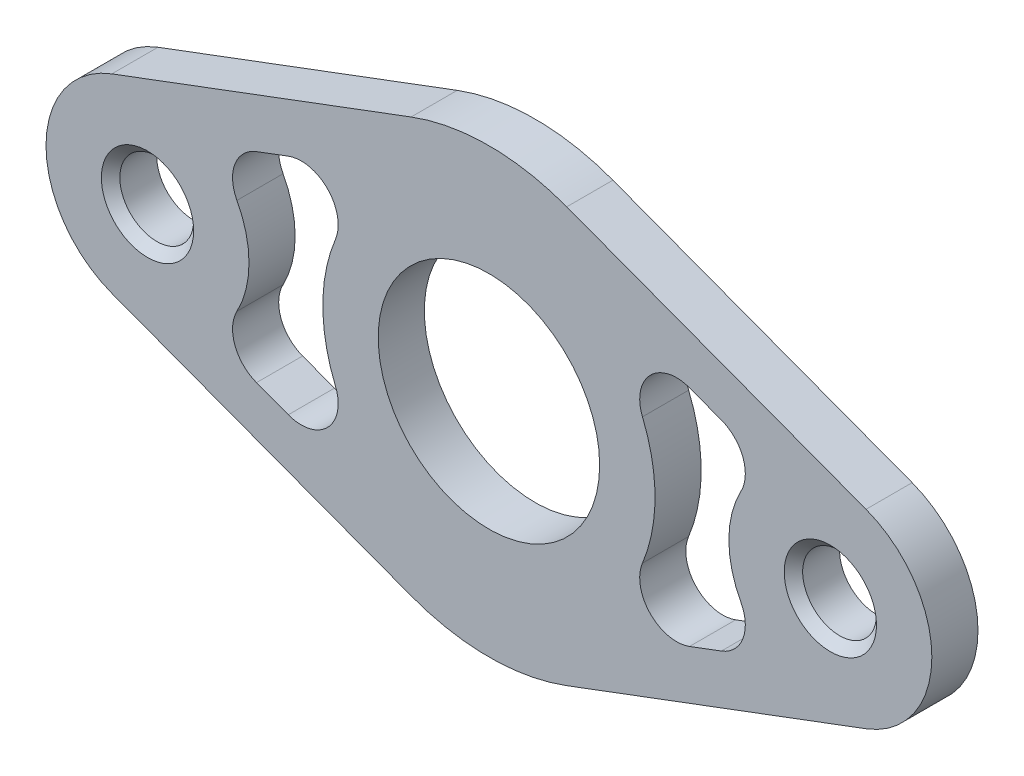
ISO-10303-21;
HEADER;
FILE_DESCRIPTION(('STEP AP214'),'2;1');
FILE_NAME('part.step','',(''),(''),'','','');
FILE_SCHEMA(('AUTOMOTIVE_DESIGN { 1 0 10303 214 1 1 1 1 }'));
ENDSEC;
DATA;
#1=APPLICATION_CONTEXT('core data for automotive mechanical design processes');
#2=APPLICATION_PROTOCOL_DEFINITION('international standard','automotive_design',2000,#1);
#3=PRODUCT_CONTEXT('',#1,'mechanical');
#4=PRODUCT('Part','Part','',(#3));
#5=PRODUCT_RELATED_PRODUCT_CATEGORY('part','',(#4));
#6=PRODUCT_DEFINITION_FORMATION('','',#4);
#7=PRODUCT_DEFINITION_CONTEXT('part definition',#1,'design');
#8=PRODUCT_DEFINITION('design','',#6,#7);
#9=PRODUCT_DEFINITION_SHAPE('','',#8);
#10=(LENGTH_UNIT() NAMED_UNIT(*) SI_UNIT(.MILLI.,.METRE.));
#11=(NAMED_UNIT(*) PLANE_ANGLE_UNIT() SI_UNIT($,.RADIAN.));
#12=(NAMED_UNIT(*) SI_UNIT($,.STERADIAN.) SOLID_ANGLE_UNIT());
#13=UNCERTAINTY_MEASURE_WITH_UNIT(LENGTH_MEASURE(1.E-05),#10,'distance_accuracy_value','');
#14=(GEOMETRIC_REPRESENTATION_CONTEXT(3) GLOBAL_UNCERTAINTY_ASSIGNED_CONTEXT((#13)) GLOBAL_UNIT_ASSIGNED_CONTEXT((#10,
#11,#12)) REPRESENTATION_CONTEXT('',''));
#15=CARTESIAN_POINT('',(0.,0.,0.));
#16=DIRECTION('',(0.,0.,1.));
#17=DIRECTION('',(1.,0.,0.));
#18=AXIS2_PLACEMENT_3D('',#15,#16,#17);
#19=CARTESIAN_POINT('',(0.,0.,5.));
#20=DIRECTION('',(0.,0.,1.));
#21=DIRECTION('',(1.,0.,0.));
#22=AXIS2_PLACEMENT_3D('',#19,#20,#21);
#23=PLANE('',#22);
#24=CARTESIAN_POINT('',(37.,0.,5.));
#25=DIRECTION('',(0.,0.,1.));
#26=DIRECTION('',(1.,0.,0.));
#27=AXIS2_PLACEMENT_3D('',#24,#25,#26);
#28=CIRCLE('',#27,4.99999999999999);
#29=CARTESIAN_POINT('',(42.,0.,5.));
#30=VERTEX_POINT('',#29);
#31=EDGE_CURVE('E481',#30,#30,#28,.F.);
#32=ORIENTED_EDGE('',*,*,#31,.T.);
#33=EDGE_LOOP('',(#32));
#34=FACE_BOUND('',#33,.T.);
#35=CARTESIAN_POINT('',(-37.,0.,5.));
#36=DIRECTION('',(0.,0.,1.));
#37=DIRECTION('',(1.,0.,0.));
#38=AXIS2_PLACEMENT_3D('',#35,#36,#37);
#39=CIRCLE('',#38,5.00000000000002);
#40=CARTESIAN_POINT('',(-32.,0.,5.));
#41=VERTEX_POINT('',#40);
#42=EDGE_CURVE('E477',#41,#41,#39,.F.);
#43=ORIENTED_EDGE('',*,*,#42,.T.);
#44=EDGE_LOOP('',(#43));
#45=FACE_BOUND('',#44,.T.);
#46=CARTESIAN_POINT('',(-20.337686340288,-8.38919032589347,5.));
#47=DIRECTION('',(0.,0.,1.));
#48=DIRECTION('',(1.,0.,0.));
#49=AXIS2_PLACEMENT_3D('',#46,#47,#48);
#50=CIRCLE('',#49,4.);
#51=CARTESIAN_POINT('',(-21.7430917456934,-12.1341650449613,5.));
#52=VERTEX_POINT('',#51);
#53=CARTESIAN_POINT('',(-16.6399251875083,-6.86388299391284,5.));
#54=VERTEX_POINT('',#53);
#55=EDGE_CURVE('E74',#52,#54,#50,.T.);
#56=ORIENTED_EDGE('',*,*,#55,.F.);
#57=DIRECTION('',(0.93624367976696,-0.351351351351352,0.));
#58=VECTOR('',#57,1.);
#59=CARTESIAN_POINT('',(-21.7430917456934,-12.1341650449613,5.));
#60=LINE('',#59,#58);
#61=CARTESIAN_POINT('',(-25.18984520045,-10.8406754222542,5.));
#62=VERTEX_POINT('',#61);
#63=EDGE_CURVE('E344',#62,#52,#60,.T.);
#64=ORIENTED_EDGE('',*,*,#63,.F.);
#65=CARTESIAN_POINT('',(-23.7844397950446,-7.09570070318635,5.));
#66=DIRECTION('',(0.,0.,1.));
#67=DIRECTION('',(-1.,0.,0.));
#68=AXIS2_PLACEMENT_3D('',#65,#66,#67);
#69=CIRCLE('',#68,4.);
#70=CARTESIAN_POINT('',(-27.3085891830327,-5.20351384900332,5.));
#71=VERTEX_POINT('',#70);
#72=EDGE_CURVE('E340',#71,#62,#69,.T.);
#73=ORIENTED_EDGE('',*,*,#72,.F.);
#74=CARTESIAN_POINT('',(-37.,0.,5.));
#75=DIRECTION('',(0.,0.,-1.));
#76=DIRECTION('',(-1.,0.,0.));
#77=AXIS2_PLACEMENT_3D('',#74,#75,#76);
#78=CIRCLE('',#77,11.);
#79=CARTESIAN_POINT('',(-27.3085891830327,5.20351384900334,5.));
#80=VERTEX_POINT('',#79);
#81=EDGE_CURVE('E336',#80,#71,#78,.T.);
#82=ORIENTED_EDGE('',*,*,#81,.F.);
#83=CARTESIAN_POINT('',(-23.7844397950446,7.09570070318637,5.));
#84=DIRECTION('',(0.,0.,1.));
#85=DIRECTION('',(1.,0.,0.));
#86=AXIS2_PLACEMENT_3D('',#83,#84,#85);
#87=CIRCLE('',#86,4.);
#88=CARTESIAN_POINT('',(-25.18984520045,10.8406754222542,5.));
#89=VERTEX_POINT('',#88);
#90=EDGE_CURVE('E332',#89,#80,#87,.T.);
#91=ORIENTED_EDGE('',*,*,#90,.F.);
#92=DIRECTION('',(-0.936243679766961,-0.351351351351351,0.));
#93=VECTOR('',#92,1.);
#94=CARTESIAN_POINT('',(-21.7430917456934,12.1341650449613,5.));
#95=LINE('',#94,#93);
#96=CARTESIAN_POINT('',(-21.7430917456934,12.1341650449613,5.));
#97=VERTEX_POINT('',#96);
#98=EDGE_CURVE('E328',#97,#89,#95,.T.);
#99=ORIENTED_EDGE('',*,*,#98,.F.);
#100=CARTESIAN_POINT('',(-20.337686340288,8.38919032589349,5.));
#101=DIRECTION('',(0.,0.,1.));
#102=DIRECTION('',(-1.,0.,0.));
#103=AXIS2_PLACEMENT_3D('',#100,#101,#102);
#104=CIRCLE('',#103,4.);
#105=CARTESIAN_POINT('',(-16.6399251875083,6.86388299391286,5.));
#106=VERTEX_POINT('',#105);
#107=EDGE_CURVE('E324',#106,#97,#104,.T.);
#108=ORIENTED_EDGE('',*,*,#107,.F.);
#109=CARTESIAN_POINT('',(0.,0.,5.));
#110=DIRECTION('',(0.,0.,-1.));
#111=DIRECTION('',(-1.,0.,0.));
#112=AXIS2_PLACEMENT_3D('',#109,#110,#111);
#113=CIRCLE('',#112,18.);
#114=EDGE_CURVE('E320',#54,#106,#113,.T.);
#115=ORIENTED_EDGE('',*,*,#114,.F.);
#116=EDGE_LOOP('',(#56,#64,#73,#82,#91,#99,#108,#115));
#117=FACE_BOUND('',#116,.T.);
#118=CARTESIAN_POINT('',(0.,0.,5.));
#119=DIRECTION('',(0.,0.,1.));
#120=DIRECTION('',(1.,0.,0.));
#121=AXIS2_PLACEMENT_3D('',#118,#119,#120);
#122=CIRCLE('',#121,12.);
#123=CARTESIAN_POINT('',(12.,0.,5.));
#124=VERTEX_POINT('',#123);
#125=EDGE_CURVE('E377',#124,#124,#122,.T.);
#126=ORIENTED_EDGE('',*,*,#125,.F.);
#127=EDGE_LOOP('',(#126));
#128=FACE_BOUND('',#127,.T.);
#129=DIRECTION('',(-0.936243679766961,0.351351351351351,0.));
#130=VECTOR('',#129,1.);
#131=CARTESIAN_POINT('',(8.43243243243243,22.4698483144071,5.));
#132=LINE('',#131,#130);
#133=CARTESIAN_POINT('',(40.8648648648649,10.2986804774366,5.));
#134=VERTEX_POINT('',#133);
#135=CARTESIAN_POINT('',(8.43243243243244,22.4698483144071,5.));
#136=VERTEX_POINT('',#135);
#137=EDGE_CURVE('E381',#134,#136,#132,.T.);
#138=ORIENTED_EDGE('',*,*,#137,.T.);
#139=CARTESIAN_POINT('',(0.,0.,5.));
#140=DIRECTION('',(0.,0.,1.));
#141=DIRECTION('',(1.,0.,0.));
#142=AXIS2_PLACEMENT_3D('',#139,#140,#141);
#143=CIRCLE('',#142,24.);
#144=CARTESIAN_POINT('',(-8.43243243243244,22.4698483144071,5.));
#145=VERTEX_POINT('',#144);
#146=EDGE_CURVE('E386',#136,#145,#143,.T.);
#147=ORIENTED_EDGE('',*,*,#146,.T.);
#148=DIRECTION('',(0.936243679766961,0.351351351351352,0.));
#149=VECTOR('',#148,1.);
#150=CARTESIAN_POINT('',(-8.43243243243244,22.4698483144071,5.));
#151=LINE('',#150,#149);
#152=CARTESIAN_POINT('',(-40.8648648648649,10.2986804774366,5.));
#153=VERTEX_POINT('',#152);
#154=EDGE_CURVE('E389',#153,#145,#151,.T.);
#155=ORIENTED_EDGE('',*,*,#154,.F.);
#156=CARTESIAN_POINT('',(-37.,0.,5.));
#157=DIRECTION('',(0.,0.,1.));
#158=DIRECTION('',(1.,0.,0.));
#159=AXIS2_PLACEMENT_3D('',#156,#157,#158);
#160=CIRCLE('',#159,11.);
#161=CARTESIAN_POINT('',(-40.8648648648649,-10.2986804774366,5.));
#162=VERTEX_POINT('',#161);
#163=EDGE_CURVE('E393',#153,#162,#160,.T.);
#164=ORIENTED_EDGE('',*,*,#163,.T.);
#165=DIRECTION('',(0.936243679766961,-0.351351351351352,0.));
#166=VECTOR('',#165,1.);
#167=CARTESIAN_POINT('',(-8.43243243243244,-22.4698483144071,5.));
#168=LINE('',#167,#166);
#169=CARTESIAN_POINT('',(-8.43243243243244,-22.4698483144071,5.));
#170=VERTEX_POINT('',#169);
#171=EDGE_CURVE('E396',#162,#170,#168,.T.);
#172=ORIENTED_EDGE('',*,*,#171,.T.);
#173=CARTESIAN_POINT('',(0.,0.,5.));
#174=DIRECTION('',(0.,0.,1.));
#175=DIRECTION('',(1.,0.,0.));
#176=AXIS2_PLACEMENT_3D('',#173,#174,#175);
#177=CIRCLE('',#176,24.);
#178=CARTESIAN_POINT('',(8.43243243243244,-22.469848314407,5.));
#179=VERTEX_POINT('',#178);
#180=EDGE_CURVE('E399',#170,#179,#177,.T.);
#181=ORIENTED_EDGE('',*,*,#180,.T.);
#182=DIRECTION('',(-0.936243679766961,-0.351351351351351,0.));
#183=VECTOR('',#182,1.);
#184=CARTESIAN_POINT('',(8.43243243243242,-22.469848314407,5.));
#185=LINE('',#184,#183);
#186=CARTESIAN_POINT('',(40.8648648648649,-10.2986804774366,5.));
#187=VERTEX_POINT('',#186);
#188=EDGE_CURVE('E402',#187,#179,#185,.T.);
#189=ORIENTED_EDGE('',*,*,#188,.F.);
#190=CARTESIAN_POINT('',(37.,0.,5.));
#191=DIRECTION('',(0.,0.,1.));
#192=DIRECTION('',(1.,0.,0.));
#193=AXIS2_PLACEMENT_3D('',#190,#191,#192);
#194=CIRCLE('',#193,11.);
#195=EDGE_CURVE('E406',#134,#187,#194,.F.);
#196=ORIENTED_EDGE('',*,*,#195,.F.);
#197=EDGE_LOOP('',(#138,#147,#155,#164,#172,#181,#189,#196));
#198=FACE_BOUND('',#197,.T.);
#199=CARTESIAN_POINT('',(20.337686340288,8.38919032589349,5.));
#200=DIRECTION('',(0.,0.,1.));
#201=DIRECTION('',(1.,0.,0.));
#202=AXIS2_PLACEMENT_3D('',#199,#200,#201);
#203=CIRCLE('',#202,4.);
#204=CARTESIAN_POINT('',(21.7430917456934,12.1341650449613,5.));
#205=VERTEX_POINT('',#204);
#206=CARTESIAN_POINT('',(16.6399251875083,6.86388299391286,5.));
#207=VERTEX_POINT('',#206);
#208=EDGE_CURVE('E66',#205,#207,#203,.T.);
#209=ORIENTED_EDGE('',*,*,#208,.F.);
#210=DIRECTION('',(-0.936243679766961,0.351351351351351,0.));
#211=VECTOR('',#210,1.);
#212=CARTESIAN_POINT('',(21.7430917456934,12.1341650449613,5.));
#213=LINE('',#212,#211);
#214=CARTESIAN_POINT('',(25.18984520045,10.8406754222542,5.));
#215=VERTEX_POINT('',#214);
#216=EDGE_CURVE('E221',#215,#205,#213,.T.);
#217=ORIENTED_EDGE('',*,*,#216,.F.);
#218=CARTESIAN_POINT('',(23.7844397950446,7.09570070318637,5.));
#219=DIRECTION('',(0.,0.,1.));
#220=DIRECTION('',(-1.,0.,0.));
#221=AXIS2_PLACEMENT_3D('',#218,#219,#220);
#222=CIRCLE('',#221,4.);
#223=CARTESIAN_POINT('',(27.3085891830327,5.20351384900334,5.));
#224=VERTEX_POINT('',#223);
#225=EDGE_CURVE('E265',#224,#215,#222,.T.);
#226=ORIENTED_EDGE('',*,*,#225,.F.);
#227=CARTESIAN_POINT('',(37.,0.,5.));
#228=DIRECTION('',(0.,0.,-1.));
#229=DIRECTION('',(1.,0.,0.));
#230=AXIS2_PLACEMENT_3D('',#227,#228,#229);
#231=CIRCLE('',#230,11.);
#232=CARTESIAN_POINT('',(27.3085891830327,-5.20351384900332,5.));
#233=VERTEX_POINT('',#232);
#234=EDGE_CURVE('E261',#233,#224,#231,.T.);
#235=ORIENTED_EDGE('',*,*,#234,.F.);
#236=CARTESIAN_POINT('',(23.7844397950446,-7.09570070318635,5.));
#237=DIRECTION('',(0.,0.,1.));
#238=DIRECTION('',(1.,0.,0.));
#239=AXIS2_PLACEMENT_3D('',#236,#237,#238);
#240=CIRCLE('',#239,4.);
#241=CARTESIAN_POINT('',(25.18984520045,-10.8406754222542,5.));
#242=VERTEX_POINT('',#241);
#243=EDGE_CURVE('E257',#242,#233,#240,.T.);
#244=ORIENTED_EDGE('',*,*,#243,.F.);
#245=DIRECTION('',(0.93624367976696,0.351351351351352,0.));
#246=VECTOR('',#245,1.);
#247=CARTESIAN_POINT('',(21.7430917456934,-12.1341650449613,5.));
#248=LINE('',#247,#246);
#249=CARTESIAN_POINT('',(21.7430917456934,-12.1341650449613,5.));
#250=VERTEX_POINT('',#249);
#251=EDGE_CURVE('E253',#250,#242,#248,.T.);
#252=ORIENTED_EDGE('',*,*,#251,.F.);
#253=CARTESIAN_POINT('',(20.337686340288,-8.38919032589347,5.));
#254=DIRECTION('',(0.,0.,1.));
#255=DIRECTION('',(-1.,0.,0.));
#256=AXIS2_PLACEMENT_3D('',#253,#254,#255);
#257=CIRCLE('',#256,4.);
#258=CARTESIAN_POINT('',(16.6399251875083,-6.86388299391284,5.));
#259=VERTEX_POINT('',#258);
#260=EDGE_CURVE('E249',#259,#250,#257,.T.);
#261=ORIENTED_EDGE('',*,*,#260,.F.);
#262=CARTESIAN_POINT('',(0.,0.,5.));
#263=DIRECTION('',(0.,0.,-1.));
#264=DIRECTION('',(1.,0.,0.));
#265=AXIS2_PLACEMENT_3D('',#262,#263,#264);
#266=CIRCLE('',#265,18.);
#267=EDGE_CURVE('E241',#207,#259,#266,.T.);
#268=ORIENTED_EDGE('',*,*,#267,.F.);
#269=EDGE_LOOP('',(#209,#217,#226,#235,#244,#252,#261,#268));
#270=FACE_BOUND('',#269,.T.);
#271=ADVANCED_FACE('F49',(#34,#45,#117,#128,#198,#270),#23,.T.);
#272=CARTESIAN_POINT('',(0.,0.,0.));
#273=DIRECTION('',(0.,0.,1.));
#274=DIRECTION('',(1.,0.,0.));
#275=AXIS2_PLACEMENT_3D('',#272,#273,#274);
#276=PLANE('',#275);
#277=CARTESIAN_POINT('',(0.,0.,0.));
#278=DIRECTION('',(0.,0.,1.));
#279=DIRECTION('',(1.,0.,0.));
#280=AXIS2_PLACEMENT_3D('',#277,#278,#279);
#281=CIRCLE('',#280,12.);
#282=CARTESIAN_POINT('',(12.,0.,0.));
#283=VERTEX_POINT('',#282);
#284=EDGE_CURVE('E230',#283,#283,#281,.T.);
#285=ORIENTED_EDGE('',*,*,#284,.T.);
#286=EDGE_LOOP('',(#285));
#287=FACE_BOUND('',#286,.T.);
#288=CARTESIAN_POINT('',(37.,0.,0.));
#289=DIRECTION('',(0.,0.,1.));
#290=DIRECTION('',(1.,0.,0.));
#291=AXIS2_PLACEMENT_3D('',#288,#289,#290);
#292=CIRCLE('',#291,4.00000000000001);
#293=CARTESIAN_POINT('',(41.,0.,0.));
#294=VERTEX_POINT('',#293);
#295=EDGE_CURVE('E414',#294,#294,#292,.F.);
#296=ORIENTED_EDGE('',*,*,#295,.F.);
#297=EDGE_LOOP('',(#296));
#298=FACE_BOUND('',#297,.T.);
#299=CARTESIAN_POINT('',(-37.,0.,0.));
#300=DIRECTION('',(0.,0.,1.));
#301=DIRECTION('',(1.,0.,0.));
#302=AXIS2_PLACEMENT_3D('',#299,#300,#301);
#303=CIRCLE('',#302,4.00000000000001);
#304=CARTESIAN_POINT('',(-33.,0.,0.));
#305=VERTEX_POINT('',#304);
#306=EDGE_CURVE('E418',#305,#305,#303,.T.);
#307=ORIENTED_EDGE('',*,*,#306,.T.);
#308=EDGE_LOOP('',(#307));
#309=FACE_BOUND('',#308,.T.);
#310=DIRECTION('',(-0.936243679766961,0.351351351351351,0.));
#311=VECTOR('',#310,1.);
#312=CARTESIAN_POINT('',(8.43243243243243,22.4698483144071,0.));
#313=LINE('',#312,#311);
#314=CARTESIAN_POINT('',(40.8648648648649,10.2986804774366,0.));
#315=VERTEX_POINT('',#314);
#316=CARTESIAN_POINT('',(8.43243243243244,22.4698483144071,0.));
#317=VERTEX_POINT('',#316);
#318=EDGE_CURVE('E422',#315,#317,#313,.T.);
#319=ORIENTED_EDGE('',*,*,#318,.F.);
#320=CARTESIAN_POINT('',(37.,0.,0.));
#321=DIRECTION('',(0.,0.,1.));
#322=DIRECTION('',(1.,0.,0.));
#323=AXIS2_PLACEMENT_3D('',#320,#321,#322);
#324=CIRCLE('',#323,11.);
#325=CARTESIAN_POINT('',(40.8648648648649,-10.2986804774366,0.));
#326=VERTEX_POINT('',#325);
#327=EDGE_CURVE('E382',#315,#326,#324,.F.);
#328=ORIENTED_EDGE('',*,*,#327,.T.);
#329=DIRECTION('',(-0.936243679766961,-0.351351351351351,0.));
#330=VECTOR('',#329,1.);
#331=CARTESIAN_POINT('',(8.43243243243242,-22.469848314407,0.));
#332=LINE('',#331,#330);
#333=CARTESIAN_POINT('',(8.43243243243244,-22.469848314407,0.));
#334=VERTEX_POINT('',#333);
#335=EDGE_CURVE('E444',#326,#334,#332,.T.);
#336=ORIENTED_EDGE('',*,*,#335,.T.);
#337=CARTESIAN_POINT('',(0.,0.,0.));
#338=DIRECTION('',(0.,0.,1.));
#339=DIRECTION('',(1.,0.,0.));
#340=AXIS2_PLACEMENT_3D('',#337,#338,#339);
#341=CIRCLE('',#340,24.);
#342=CARTESIAN_POINT('',(-8.43243243243244,-22.4698483144071,0.));
#343=VERTEX_POINT('',#342);
#344=EDGE_CURVE('E440',#343,#334,#341,.T.);
#345=ORIENTED_EDGE('',*,*,#344,.F.);
#346=DIRECTION('',(0.936243679766961,-0.351351351351352,0.));
#347=VECTOR('',#346,1.);
#348=CARTESIAN_POINT('',(-8.43243243243244,-22.4698483144071,0.));
#349=LINE('',#348,#347);
#350=CARTESIAN_POINT('',(-40.8648648648649,-10.2986804774366,0.));
#351=VERTEX_POINT('',#350);
#352=EDGE_CURVE('E437',#351,#343,#349,.T.);
#353=ORIENTED_EDGE('',*,*,#352,.F.);
#354=CARTESIAN_POINT('',(-37.,0.,0.));
#355=DIRECTION('',(0.,0.,1.));
#356=DIRECTION('',(1.,0.,0.));
#357=AXIS2_PLACEMENT_3D('',#354,#355,#356);
#358=CIRCLE('',#357,11.);
#359=CARTESIAN_POINT('',(-40.8648648648649,10.2986804774366,0.));
#360=VERTEX_POINT('',#359);
#361=EDGE_CURVE('E434',#360,#351,#358,.T.);
#362=ORIENTED_EDGE('',*,*,#361,.F.);
#363=DIRECTION('',(0.936243679766961,0.351351351351352,0.));
#364=VECTOR('',#363,1.);
#365=CARTESIAN_POINT('',(-8.43243243243244,22.4698483144071,0.));
#366=LINE('',#365,#364);
#367=CARTESIAN_POINT('',(-8.43243243243244,22.4698483144071,0.));
#368=VERTEX_POINT('',#367);
#369=EDGE_CURVE('E430',#360,#368,#366,.T.);
#370=ORIENTED_EDGE('',*,*,#369,.T.);
#371=CARTESIAN_POINT('',(0.,0.,0.));
#372=DIRECTION('',(0.,0.,1.));
#373=DIRECTION('',(1.,0.,0.));
#374=AXIS2_PLACEMENT_3D('',#371,#372,#373);
#375=CIRCLE('',#374,24.);
#376=EDGE_CURVE('E426',#317,#368,#375,.T.);
#377=ORIENTED_EDGE('',*,*,#376,.F.);
#378=EDGE_LOOP('',(#319,#328,#336,#345,#353,#362,#370,#377));
#379=FACE_BOUND('',#378,.T.);
#380=DIRECTION('',(-0.936243679766961,0.351351351351352,0.));
#381=VECTOR('',#380,1.);
#382=CARTESIAN_POINT('',(-21.7430917456934,-12.1341650449613,0.));
#383=LINE('',#382,#381);
#384=CARTESIAN_POINT('',(-21.7430917456934,-12.1341650449613,0.));
#385=VERTEX_POINT('',#384);
#386=CARTESIAN_POINT('',(-25.18984520045,-10.8406754222542,0.));
#387=VERTEX_POINT('',#386);
#388=EDGE_CURVE('E310',#385,#387,#383,.T.);
#389=ORIENTED_EDGE('',*,*,#388,.F.);
#390=CARTESIAN_POINT('',(-20.337686340288,-8.38919032589347,0.));
#391=DIRECTION('',(0.,0.,1.));
#392=DIRECTION('',(1.,0.,0.));
#393=AXIS2_PLACEMENT_3D('',#390,#391,#392);
#394=CIRCLE('',#393,4.);
#395=CARTESIAN_POINT('',(-16.6399251875083,-6.86388299391284,0.));
#396=VERTEX_POINT('',#395);
#397=EDGE_CURVE('E314',#396,#385,#394,.F.);
#398=ORIENTED_EDGE('',*,*,#397,.F.);
#399=CARTESIAN_POINT('',(0.,0.,0.));
#400=DIRECTION('',(0.,0.,1.));
#401=DIRECTION('',(1.,0.,0.));
#402=AXIS2_PLACEMENT_3D('',#399,#400,#401);
#403=CIRCLE('',#402,18.);
#404=CARTESIAN_POINT('',(-16.6399251875083,6.86388299391286,0.));
#405=VERTEX_POINT('',#404);
#406=EDGE_CURVE('E352',#405,#396,#403,.T.);
#407=ORIENTED_EDGE('',*,*,#406,.F.);
#408=CARTESIAN_POINT('',(-20.337686340288,8.38919032589349,0.));
#409=DIRECTION('',(0.,0.,1.));
#410=DIRECTION('',(1.,0.,0.));
#411=AXIS2_PLACEMENT_3D('',#408,#409,#410);
#412=CIRCLE('',#411,4.);
#413=CARTESIAN_POINT('',(-21.7430917456934,12.1341650449613,0.));
#414=VERTEX_POINT('',#413);
#415=EDGE_CURVE('E291',#414,#405,#412,.F.);
#416=ORIENTED_EDGE('',*,*,#415,.F.);
#417=DIRECTION('',(0.936243679766961,0.351351351351351,0.));
#418=VECTOR('',#417,1.);
#419=CARTESIAN_POINT('',(-21.7430917456934,12.1341650449613,0.));
#420=LINE('',#419,#418);
#421=CARTESIAN_POINT('',(-25.18984520045,10.8406754222542,0.));
#422=VERTEX_POINT('',#421);
#423=EDGE_CURVE('E294',#422,#414,#420,.T.);
#424=ORIENTED_EDGE('',*,*,#423,.F.);
#425=CARTESIAN_POINT('',(-23.7844397950446,7.09570070318637,0.));
#426=DIRECTION('',(0.,0.,1.));
#427=DIRECTION('',(1.,0.,0.));
#428=AXIS2_PLACEMENT_3D('',#425,#426,#427);
#429=CIRCLE('',#428,4.);
#430=CARTESIAN_POINT('',(-27.3085891830327,5.20351384900334,0.));
#431=VERTEX_POINT('',#430);
#432=EDGE_CURVE('E298',#431,#422,#429,.F.);
#433=ORIENTED_EDGE('',*,*,#432,.F.);
#434=CARTESIAN_POINT('',(-37.,0.,0.));
#435=DIRECTION('',(0.,0.,1.));
#436=DIRECTION('',(1.,0.,0.));
#437=AXIS2_PLACEMENT_3D('',#434,#435,#436);
#438=CIRCLE('',#437,11.);
#439=CARTESIAN_POINT('',(-27.3085891830327,-5.20351384900332,0.));
#440=VERTEX_POINT('',#439);
#441=EDGE_CURVE('E302',#440,#431,#438,.T.);
#442=ORIENTED_EDGE('',*,*,#441,.F.);
#443=CARTESIAN_POINT('',(-23.7844397950446,-7.09570070318635,0.));
#444=DIRECTION('',(0.,0.,1.));
#445=DIRECTION('',(1.,0.,0.));
#446=AXIS2_PLACEMENT_3D('',#443,#444,#445);
#447=CIRCLE('',#446,4.);
#448=EDGE_CURVE('E306',#387,#440,#447,.F.);
#449=ORIENTED_EDGE('',*,*,#448,.F.);
#450=EDGE_LOOP('',(#389,#398,#407,#416,#424,#433,#442,#449));
#451=FACE_BOUND('',#450,.T.);
#452=DIRECTION('',(0.936243679766961,-0.351351351351351,0.));
#453=VECTOR('',#452,1.);
#454=CARTESIAN_POINT('',(21.7430917456934,12.1341650449613,0.));
#455=LINE('',#454,#453);
#456=CARTESIAN_POINT('',(21.7430917456934,12.1341650449613,0.));
#457=VERTEX_POINT('',#456);
#458=CARTESIAN_POINT('',(25.18984520045,10.8406754222542,0.));
#459=VERTEX_POINT('',#458);
#460=EDGE_CURVE('E236',#457,#459,#455,.T.);
#461=ORIENTED_EDGE('',*,*,#460,.F.);
#462=CARTESIAN_POINT('',(20.337686340288,8.38919032589349,0.));
#463=DIRECTION('',(0.,0.,1.));
#464=DIRECTION('',(1.,0.,0.));
#465=AXIS2_PLACEMENT_3D('',#462,#463,#464);
#466=CIRCLE('',#465,4.);
#467=CARTESIAN_POINT('',(16.6399251875083,6.86388299391286,0.));
#468=VERTEX_POINT('',#467);
#469=EDGE_CURVE('E214',#468,#457,#466,.F.);
#470=ORIENTED_EDGE('',*,*,#469,.F.);
#471=CARTESIAN_POINT('',(0.,0.,0.));
#472=DIRECTION('',(0.,0.,1.));
#473=DIRECTION('',(1.,0.,0.));
#474=AXIS2_PLACEMENT_3D('',#471,#472,#473);
#475=CIRCLE('',#474,18.);
#476=CARTESIAN_POINT('',(16.6399251875083,-6.86388299391284,0.));
#477=VERTEX_POINT('',#476);
#478=EDGE_CURVE('E225',#477,#468,#475,.T.);
#479=ORIENTED_EDGE('',*,*,#478,.F.);
#480=CARTESIAN_POINT('',(20.337686340288,-8.38919032589347,0.));
#481=DIRECTION('',(0.,0.,1.));
#482=DIRECTION('',(1.,0.,0.));
#483=AXIS2_PLACEMENT_3D('',#480,#481,#482);
#484=CIRCLE('',#483,4.);
#485=CARTESIAN_POINT('',(21.7430917456934,-12.1341650449613,0.));
#486=VERTEX_POINT('',#485);
#487=EDGE_CURVE('E376',#486,#477,#484,.F.);
#488=ORIENTED_EDGE('',*,*,#487,.F.);
#489=DIRECTION('',(-0.936243679766961,-0.351351351351352,0.));
#490=VECTOR('',#489,1.);
#491=CARTESIAN_POINT('',(21.7430917456934,-12.1341650449613,0.));
#492=LINE('',#491,#490);
#493=CARTESIAN_POINT('',(25.18984520045,-10.8406754222542,0.));
#494=VERTEX_POINT('',#493);
#495=EDGE_CURVE('E520',#494,#486,#492,.T.);
#496=ORIENTED_EDGE('',*,*,#495,.F.);
#497=CARTESIAN_POINT('',(23.7844397950446,-7.09570070318635,0.));
#498=DIRECTION('',(0.,0.,1.));
#499=DIRECTION('',(1.,0.,0.));
#500=AXIS2_PLACEMENT_3D('',#497,#498,#499);
#501=CIRCLE('',#500,4.);
#502=CARTESIAN_POINT('',(27.3085891830327,-5.20351384900332,0.));
#503=VERTEX_POINT('',#502);
#504=EDGE_CURVE('E523',#503,#494,#501,.F.);
#505=ORIENTED_EDGE('',*,*,#504,.F.);
#506=CARTESIAN_POINT('',(37.,0.,0.));
#507=DIRECTION('',(0.,0.,1.));
#508=DIRECTION('',(1.,0.,0.));
#509=AXIS2_PLACEMENT_3D('',#506,#507,#508);
#510=CIRCLE('',#509,11.);
#511=CARTESIAN_POINT('',(27.3085891830327,5.20351384900334,0.));
#512=VERTEX_POINT('',#511);
#513=EDGE_CURVE('E529',#512,#503,#510,.T.);
#514=ORIENTED_EDGE('',*,*,#513,.F.);
#515=CARTESIAN_POINT('',(23.7844397950446,7.09570070318637,0.));
#516=DIRECTION('',(0.,0.,1.));
#517=DIRECTION('',(1.,0.,0.));
#518=AXIS2_PLACEMENT_3D('',#515,#516,#517);
#519=CIRCLE('',#518,4.);
#520=EDGE_CURVE('E243',#459,#512,#519,.F.);
#521=ORIENTED_EDGE('',*,*,#520,.F.);
#522=EDGE_LOOP('',(#461,#470,#479,#488,#496,#505,#514,#521));
#523=FACE_BOUND('',#522,.T.);
#524=ADVANCED_FACE('F233',(#287,#298,#309,#379,#451,#523),#276,.F.);
#525=CARTESIAN_POINT('',(8.43243243243243,22.4698483144071,5.));
#526=DIRECTION('',(-0.351351351351351,-0.936243679766961,0.));
#527=DIRECTION('',(0.936243679766961,-0.351351351351351,0.));
#528=AXIS2_PLACEMENT_3D('',#525,#526,#527);
#529=PLANE('',#528);
#530=ORIENTED_EDGE('',*,*,#318,.T.);
#531=DIRECTION('',(0.,0.,-1.));
#532=VECTOR('',#531,1.);
#533=CARTESIAN_POINT('',(8.43243243243244,22.4698483144071,5.));
#534=LINE('',#533,#532);
#535=EDGE_CURVE('E473',#136,#317,#534,.T.);
#536=ORIENTED_EDGE('',*,*,#535,.F.);
#537=ORIENTED_EDGE('',*,*,#137,.F.);
#538=DIRECTION('',(0.,0.,-1.));
#539=VECTOR('',#538,1.);
#540=CARTESIAN_POINT('',(40.8648648648649,10.2986804774366,5.));
#541=LINE('',#540,#539);
#542=EDGE_CURVE('E410',#134,#315,#541,.T.);
#543=ORIENTED_EDGE('',*,*,#542,.T.);
#544=EDGE_LOOP('',(#530,#536,#537,#543));
#545=FACE_BOUND('',#544,.T.);
#546=ADVANCED_FACE('F594',(#545),#529,.F.);
#547=CARTESIAN_POINT('',(0.,0.,5.));
#548=DIRECTION('',(0.,0.,-1.));
#549=DIRECTION('',(-1.,0.,0.));
#550=AXIS2_PLACEMENT_3D('',#547,#548,#549);
#551=CYLINDRICAL_SURFACE('',#550,24.);
#552=ORIENTED_EDGE('',*,*,#376,.T.);
#553=DIRECTION('',(0.,0.,-1.));
#554=VECTOR('',#553,1.);
#555=CARTESIAN_POINT('',(-8.43243243243244,22.4698483144071,5.));
#556=LINE('',#555,#554);
#557=EDGE_CURVE('E470',#145,#368,#556,.T.);
#558=ORIENTED_EDGE('',*,*,#557,.F.);
#559=ORIENTED_EDGE('',*,*,#146,.F.);
#560=ORIENTED_EDGE('',*,*,#535,.T.);
#561=EDGE_LOOP('',(#552,#558,#559,#560));
#562=FACE_BOUND('',#561,.T.);
#563=ADVANCED_FACE('F620',(#562),#551,.T.);
#564=CARTESIAN_POINT('',(-8.43243243243244,22.4698483144071,5.));
#565=DIRECTION('',(-0.351351351351352,0.936243679766961,0.));
#566=DIRECTION('',(-0.936243679766961,-0.351351351351352,0.));
#567=AXIS2_PLACEMENT_3D('',#564,#565,#566);
#568=PLANE('',#567);
#569=ORIENTED_EDGE('',*,*,#369,.F.);
#570=DIRECTION('',(0.,0.,-1.));
#571=VECTOR('',#570,1.);
#572=CARTESIAN_POINT('',(-40.8648648648649,10.2986804774366,5.));
#573=LINE('',#572,#571);
#574=EDGE_CURVE('E467',#153,#360,#573,.T.);
#575=ORIENTED_EDGE('',*,*,#574,.F.);
#576=ORIENTED_EDGE('',*,*,#154,.T.);
#577=ORIENTED_EDGE('',*,*,#557,.T.);
#578=EDGE_LOOP('',(#569,#575,#576,#577));
#579=FACE_BOUND('',#578,.T.);
#580=ADVANCED_FACE('F616',(#579),#568,.T.);
#581=CARTESIAN_POINT('',(-37.,0.,5.));
#582=DIRECTION('',(0.,0.,-1.));
#583=DIRECTION('',(-1.,0.,0.));
#584=AXIS2_PLACEMENT_3D('',#581,#582,#583);
#585=CYLINDRICAL_SURFACE('',#584,11.);
#586=ORIENTED_EDGE('',*,*,#361,.T.);
#587=DIRECTION('',(0.,0.,-1.));
#588=VECTOR('',#587,1.);
#589=CARTESIAN_POINT('',(-40.8648648648649,-10.2986804774366,5.));
#590=LINE('',#589,#588);
#591=EDGE_CURVE('E463',#162,#351,#590,.T.);
#592=ORIENTED_EDGE('',*,*,#591,.F.);
#593=ORIENTED_EDGE('',*,*,#163,.F.);
#594=ORIENTED_EDGE('',*,*,#574,.T.);
#595=EDGE_LOOP('',(#586,#592,#593,#594));
#596=FACE_BOUND('',#595,.T.);
#597=ADVANCED_FACE('F612',(#596),#585,.T.);
#598=CARTESIAN_POINT('',(-8.43243243243244,-22.4698483144071,5.));
#599=DIRECTION('',(0.351351351351352,0.936243679766961,0.));
#600=DIRECTION('',(-0.936243679766961,0.351351351351352,0.));
#601=AXIS2_PLACEMENT_3D('',#598,#599,#600);
#602=PLANE('',#601);
#603=ORIENTED_EDGE('',*,*,#352,.T.);
#604=DIRECTION('',(0.,0.,-1.));
#605=VECTOR('',#604,1.);
#606=CARTESIAN_POINT('',(-8.43243243243244,-22.4698483144071,5.));
#607=LINE('',#606,#605);
#608=EDGE_CURVE('E459',#170,#343,#607,.T.);
#609=ORIENTED_EDGE('',*,*,#608,.F.);
#610=ORIENTED_EDGE('',*,*,#171,.F.);
#611=ORIENTED_EDGE('',*,*,#591,.T.);
#612=EDGE_LOOP('',(#603,#609,#610,#611));
#613=FACE_BOUND('',#612,.T.);
#614=ADVANCED_FACE('F608',(#613),#602,.F.);
#615=CARTESIAN_POINT('',(0.,0.,5.));
#616=DIRECTION('',(0.,0.,-1.));
#617=DIRECTION('',(-1.,0.,0.));
#618=AXIS2_PLACEMENT_3D('',#615,#616,#617);
#619=CYLINDRICAL_SURFACE('',#618,24.);
#620=ORIENTED_EDGE('',*,*,#344,.T.);
#621=DIRECTION('',(0.,0.,-1.));
#622=VECTOR('',#621,1.);
#623=CARTESIAN_POINT('',(8.43243243243244,-22.469848314407,5.));
#624=LINE('',#623,#622);
#625=EDGE_CURVE('E456',#179,#334,#624,.T.);
#626=ORIENTED_EDGE('',*,*,#625,.F.);
#627=ORIENTED_EDGE('',*,*,#180,.F.);
#628=ORIENTED_EDGE('',*,*,#608,.T.);
#629=EDGE_LOOP('',(#620,#626,#627,#628));
#630=FACE_BOUND('',#629,.T.);
#631=ADVANCED_FACE('F604',(#630),#619,.T.);
#632=CARTESIAN_POINT('',(8.43243243243242,-22.469848314407,5.));
#633=DIRECTION('',(0.351351351351351,-0.936243679766961,0.));
#634=DIRECTION('',(0.936243679766961,0.351351351351351,0.));
#635=AXIS2_PLACEMENT_3D('',#632,#633,#634);
#636=PLANE('',#635);
#637=ORIENTED_EDGE('',*,*,#335,.F.);
#638=DIRECTION('',(0.,0.,-1.));
#639=VECTOR('',#638,1.);
#640=CARTESIAN_POINT('',(40.8648648648649,-10.2986804774366,5.));
#641=LINE('',#640,#639);
#642=EDGE_CURVE('E453',#187,#326,#641,.T.);
#643=ORIENTED_EDGE('',*,*,#642,.F.);
#644=ORIENTED_EDGE('',*,*,#188,.T.);
#645=ORIENTED_EDGE('',*,*,#625,.T.);
#646=EDGE_LOOP('',(#637,#643,#644,#645));
#647=FACE_BOUND('',#646,.T.);
#648=ADVANCED_FACE('F600',(#647),#636,.T.);
#649=CARTESIAN_POINT('',(-37.,0.,5.));
#650=DIRECTION('',(0.,0.,-1.));
#651=DIRECTION('',(-1.,0.,0.));
#652=AXIS2_PLACEMENT_3D('',#649,#650,#651);
#653=CYLINDRICAL_SURFACE('',#652,4.00000000000001);
#654=CARTESIAN_POINT('',(-37.,0.,3.99999999999999));
#655=DIRECTION('',(0.,0.,1.));
#656=DIRECTION('',(1.,0.,0.));
#657=AXIS2_PLACEMENT_3D('',#654,#655,#656);
#658=CIRCLE('',#657,4.00000000000001);
#659=CARTESIAN_POINT('',(-33.,0.,3.99999999999999));
#660=VERTEX_POINT('',#659);
#661=EDGE_CURVE('E11',#660,#660,#658,.T.);
#662=ORIENTED_EDGE('',*,*,#661,.T.);
#663=EDGE_LOOP('',(#662));
#664=FACE_BOUND('',#663,.T.);
#665=ORIENTED_EDGE('',*,*,#306,.F.);
#666=EDGE_LOOP('',(#665));
#667=FACE_BOUND('',#666,.T.);
#668=ADVANCED_FACE('F603',(#664,#667),#653,.F.);
#669=CARTESIAN_POINT('',(37.,0.,5.));
#670=DIRECTION('',(0.,0.,-1.));
#671=DIRECTION('',(-1.,0.,0.));
#672=AXIS2_PLACEMENT_3D('',#669,#670,#671);
#673=CYLINDRICAL_SURFACE('',#672,4.00000000000001);
#674=CARTESIAN_POINT('',(37.,0.,4.));
#675=DIRECTION('',(0.,0.,1.));
#676=DIRECTION('',(1.,0.,0.));
#677=AXIS2_PLACEMENT_3D('',#674,#675,#676);
#678=CIRCLE('',#677,4.00000000000001);
#679=CARTESIAN_POINT('',(41.,0.,4.));
#680=VERTEX_POINT('',#679);
#681=EDGE_CURVE('E59',#680,#680,#678,.T.);
#682=ORIENTED_EDGE('',*,*,#681,.T.);
#683=EDGE_LOOP('',(#682));
#684=FACE_BOUND('',#683,.T.);
#685=ORIENTED_EDGE('',*,*,#295,.T.);
#686=EDGE_LOOP('',(#685));
#687=FACE_BOUND('',#686,.T.);
#688=ADVANCED_FACE('F488',(#684,#687),#673,.F.);
#689=CARTESIAN_POINT('',(0.,0.,5.));
#690=DIRECTION('',(0.,0.,-1.));
#691=DIRECTION('',(-1.,0.,0.));
#692=AXIS2_PLACEMENT_3D('',#689,#690,#691);
#693=CYLINDRICAL_SURFACE('',#692,12.);
#694=ORIENTED_EDGE('',*,*,#125,.T.);
#695=EDGE_LOOP('',(#694));
#696=FACE_BOUND('',#695,.T.);
#697=ORIENTED_EDGE('',*,*,#284,.F.);
#698=EDGE_LOOP('',(#697));
#699=FACE_BOUND('',#698,.T.);
#700=ADVANCED_FACE('F598',(#696,#699),#693,.F.);
#701=CARTESIAN_POINT('',(37.,0.,5.));
#702=DIRECTION('',(0.,0.,-1.));
#703=DIRECTION('',(-1.,0.,0.));
#704=AXIS2_PLACEMENT_3D('',#701,#702,#703);
#705=CYLINDRICAL_SURFACE('',#704,11.);
#706=ORIENTED_EDGE('',*,*,#327,.F.);
#707=ORIENTED_EDGE('',*,*,#542,.F.);
#708=ORIENTED_EDGE('',*,*,#195,.T.);
#709=ORIENTED_EDGE('',*,*,#642,.T.);
#710=EDGE_LOOP('',(#706,#707,#708,#709));
#711=FACE_BOUND('',#710,.T.);
#712=ADVANCED_FACE('F590',(#711),#705,.T.);
#713=CARTESIAN_POINT('',(-20.337686340288,-8.38919032589347,-0.00100000000000013));
#714=DIRECTION('',(0.,0.,1.));
#715=DIRECTION('',(1.,0.,0.));
#716=AXIS2_PLACEMENT_3D('',#713,#714,#715);
#717=CYLINDRICAL_SURFACE('',#716,4.);
#718=ORIENTED_EDGE('',*,*,#397,.T.);
#719=DIRECTION('',(0.,0.,1.));
#720=VECTOR('',#719,1.);
#721=CARTESIAN_POINT('',(-21.7430917456934,-12.1341650449613,-0.00100000000000013));
#722=LINE('',#721,#720);
#723=EDGE_CURVE('E349',#385,#52,#722,.T.);
#724=ORIENTED_EDGE('',*,*,#723,.T.);
#725=ORIENTED_EDGE('',*,*,#55,.T.);
#726=DIRECTION('',(0.,0.,1.));
#727=VECTOR('',#726,1.);
#728=CARTESIAN_POINT('',(-16.6399251875083,-6.86388299391284,-0.00100000000000013));
#729=LINE('',#728,#727);
#730=EDGE_CURVE('E348',#396,#54,#729,.T.);
#731=ORIENTED_EDGE('',*,*,#730,.F.);
#732=EDGE_LOOP('',(#718,#724,#725,#731));
#733=FACE_BOUND('',#732,.T.);
#734=ADVANCED_FACE('F565',(#733),#717,.F.);
#735=CARTESIAN_POINT('',(-21.7430917456934,-12.1341650449613,-0.00100000000000013));
#736=DIRECTION('',(-0.351351351351352,-0.936243679766961,0.));
#737=DIRECTION('',(0.936243679766961,-0.351351351351352,0.));
#738=AXIS2_PLACEMENT_3D('',#735,#736,#737);
#739=PLANE('',#738);
#740=ORIENTED_EDGE('',*,*,#388,.T.);
#741=DIRECTION('',(0.,0.,1.));
#742=VECTOR('',#741,1.);
#743=CARTESIAN_POINT('',(-25.18984520045,-10.8406754222542,-0.00100000000000013));
#744=LINE('',#743,#742);
#745=EDGE_CURVE('E353',#387,#62,#744,.T.);
#746=ORIENTED_EDGE('',*,*,#745,.T.);
#747=ORIENTED_EDGE('',*,*,#63,.T.);
#748=ORIENTED_EDGE('',*,*,#723,.F.);
#749=EDGE_LOOP('',(#740,#746,#747,#748));
#750=FACE_BOUND('',#749,.T.);
#751=ADVANCED_FACE('F561',(#750),#739,.F.);
#752=CARTESIAN_POINT('',(-23.7844397950446,-7.09570070318635,-0.00100000000000013));
#753=DIRECTION('',(0.,0.,1.));
#754=DIRECTION('',(1.,0.,0.));
#755=AXIS2_PLACEMENT_3D('',#752,#753,#754);
#756=CYLINDRICAL_SURFACE('',#755,4.);
#757=ORIENTED_EDGE('',*,*,#448,.T.);
#758=DIRECTION('',(0.,0.,1.));
#759=VECTOR('',#758,1.);
#760=CARTESIAN_POINT('',(-27.3085891830327,-5.20351384900332,-0.00100000000000013));
#761=LINE('',#760,#759);
#762=EDGE_CURVE('E356',#440,#71,#761,.T.);
#763=ORIENTED_EDGE('',*,*,#762,.T.);
#764=ORIENTED_EDGE('',*,*,#72,.T.);
#765=ORIENTED_EDGE('',*,*,#745,.F.);
#766=EDGE_LOOP('',(#757,#763,#764,#765));
#767=FACE_BOUND('',#766,.T.);
#768=ADVANCED_FACE('F564',(#767),#756,.F.);
#769=CARTESIAN_POINT('',(-37.,0.,-0.00100000000000013));
#770=DIRECTION('',(0.,0.,1.));
#771=DIRECTION('',(1.,0.,0.));
#772=AXIS2_PLACEMENT_3D('',#769,#770,#771);
#773=CYLINDRICAL_SURFACE('',#772,11.);
#774=ORIENTED_EDGE('',*,*,#441,.T.);
#775=DIRECTION('',(0.,0.,1.));
#776=VECTOR('',#775,1.);
#777=CARTESIAN_POINT('',(-27.3085891830327,5.20351384900334,-0.00100000000000013));
#778=LINE('',#777,#776);
#779=EDGE_CURVE('E359',#431,#80,#778,.T.);
#780=ORIENTED_EDGE('',*,*,#779,.T.);
#781=ORIENTED_EDGE('',*,*,#81,.T.);
#782=ORIENTED_EDGE('',*,*,#762,.F.);
#783=EDGE_LOOP('',(#774,#780,#781,#782));
#784=FACE_BOUND('',#783,.T.);
#785=ADVANCED_FACE('F569',(#784),#773,.T.);
#786=CARTESIAN_POINT('',(-23.7844397950446,7.09570070318637,-0.00100000000000013));
#787=DIRECTION('',(0.,0.,1.));
#788=DIRECTION('',(1.,0.,0.));
#789=AXIS2_PLACEMENT_3D('',#786,#787,#788);
#790=CYLINDRICAL_SURFACE('',#789,4.);
#791=ORIENTED_EDGE('',*,*,#432,.T.);
#792=DIRECTION('',(0.,0.,1.));
#793=VECTOR('',#792,1.);
#794=CARTESIAN_POINT('',(-25.18984520045,10.8406754222542,-0.00100000000000013));
#795=LINE('',#794,#793);
#796=EDGE_CURVE('E362',#422,#89,#795,.T.);
#797=ORIENTED_EDGE('',*,*,#796,.T.);
#798=ORIENTED_EDGE('',*,*,#90,.T.);
#799=ORIENTED_EDGE('',*,*,#779,.F.);
#800=EDGE_LOOP('',(#791,#797,#798,#799));
#801=FACE_BOUND('',#800,.T.);
#802=ADVANCED_FACE('F573',(#801),#790,.F.);
#803=CARTESIAN_POINT('',(-21.7430917456934,12.1341650449613,-0.00100000000000013));
#804=DIRECTION('',(-0.351351351351351,0.936243679766961,0.));
#805=DIRECTION('',(-0.936243679766961,-0.351351351351351,0.));
#806=AXIS2_PLACEMENT_3D('',#803,#804,#805);
#807=PLANE('',#806);
#808=ORIENTED_EDGE('',*,*,#423,.T.);
#809=DIRECTION('',(0.,0.,1.));
#810=VECTOR('',#809,1.);
#811=CARTESIAN_POINT('',(-21.7430917456934,12.1341650449613,-0.00100000000000013));
#812=LINE('',#811,#810);
#813=EDGE_CURVE('E365',#414,#97,#812,.T.);
#814=ORIENTED_EDGE('',*,*,#813,.T.);
#815=ORIENTED_EDGE('',*,*,#98,.T.);
#816=ORIENTED_EDGE('',*,*,#796,.F.);
#817=EDGE_LOOP('',(#808,#814,#815,#816));
#818=FACE_BOUND('',#817,.T.);
#819=ADVANCED_FACE('F577',(#818),#807,.F.);
#820=CARTESIAN_POINT('',(-20.337686340288,8.38919032589349,-0.00100000000000013));
#821=DIRECTION('',(0.,0.,1.));
#822=DIRECTION('',(1.,0.,0.));
#823=AXIS2_PLACEMENT_3D('',#820,#821,#822);
#824=CYLINDRICAL_SURFACE('',#823,4.);
#825=ORIENTED_EDGE('',*,*,#415,.T.);
#826=DIRECTION('',(0.,0.,1.));
#827=VECTOR('',#826,1.);
#828=CARTESIAN_POINT('',(-16.6399251875083,6.86388299391286,-0.00100000000000013));
#829=LINE('',#828,#827);
#830=EDGE_CURVE('E368',#405,#106,#829,.T.);
#831=ORIENTED_EDGE('',*,*,#830,.T.);
#832=ORIENTED_EDGE('',*,*,#107,.T.);
#833=ORIENTED_EDGE('',*,*,#813,.F.);
#834=EDGE_LOOP('',(#825,#831,#832,#833));
#835=FACE_BOUND('',#834,.T.);
#836=ADVANCED_FACE('F581',(#835),#824,.F.);
#837=CARTESIAN_POINT('',(0.,0.,-0.00100000000000013));
#838=DIRECTION('',(0.,0.,1.));
#839=DIRECTION('',(1.,0.,0.));
#840=AXIS2_PLACEMENT_3D('',#837,#838,#839);
#841=CYLINDRICAL_SURFACE('',#840,18.);
#842=ORIENTED_EDGE('',*,*,#406,.T.);
#843=ORIENTED_EDGE('',*,*,#730,.T.);
#844=ORIENTED_EDGE('',*,*,#114,.T.);
#845=ORIENTED_EDGE('',*,*,#830,.F.);
#846=EDGE_LOOP('',(#842,#843,#844,#845));
#847=FACE_BOUND('',#846,.T.);
#848=ADVANCED_FACE('F560',(#847),#841,.T.);
#849=CARTESIAN_POINT('',(20.337686340288,8.38919032589349,-0.00100000000000013));
#850=DIRECTION('',(0.,0.,1.));
#851=DIRECTION('',(1.,0.,0.));
#852=AXIS2_PLACEMENT_3D('',#849,#850,#851);
#853=CYLINDRICAL_SURFACE('',#852,4.);
#854=ORIENTED_EDGE('',*,*,#469,.T.);
#855=DIRECTION('',(0.,0.,1.));
#856=VECTOR('',#855,1.);
#857=CARTESIAN_POINT('',(21.7430917456934,12.1341650449613,-0.00100000000000013));
#858=LINE('',#857,#856);
#859=EDGE_CURVE('E231',#457,#205,#858,.T.);
#860=ORIENTED_EDGE('',*,*,#859,.T.);
#861=ORIENTED_EDGE('',*,*,#208,.T.);
#862=DIRECTION('',(0.,0.,1.));
#863=VECTOR('',#862,1.);
#864=CARTESIAN_POINT('',(16.6399251875083,6.86388299391286,-0.00100000000000013));
#865=LINE('',#864,#863);
#866=EDGE_CURVE('E210',#468,#207,#865,.T.);
#867=ORIENTED_EDGE('',*,*,#866,.F.);
#868=EDGE_LOOP('',(#854,#860,#861,#867));
#869=FACE_BOUND('',#868,.T.);
#870=ADVANCED_FACE('F212',(#869),#853,.F.);
#871=CARTESIAN_POINT('',(21.7430917456934,12.1341650449613,-0.00100000000000013));
#872=DIRECTION('',(0.351351351351351,0.936243679766961,0.));
#873=DIRECTION('',(-0.936243679766961,0.351351351351351,0.));
#874=AXIS2_PLACEMENT_3D('',#871,#872,#873);
#875=PLANE('',#874);
#876=ORIENTED_EDGE('',*,*,#460,.T.);
#877=DIRECTION('',(0.,0.,1.));
#878=VECTOR('',#877,1.);
#879=CARTESIAN_POINT('',(25.18984520045,10.8406754222542,-0.00100000000000013));
#880=LINE('',#879,#878);
#881=EDGE_CURVE('E274',#459,#215,#880,.T.);
#882=ORIENTED_EDGE('',*,*,#881,.T.);
#883=ORIENTED_EDGE('',*,*,#216,.T.);
#884=ORIENTED_EDGE('',*,*,#859,.F.);
#885=EDGE_LOOP('',(#876,#882,#883,#884));
#886=FACE_BOUND('',#885,.T.);
#887=ADVANCED_FACE('F559',(#886),#875,.F.);
#888=CARTESIAN_POINT('',(23.7844397950446,7.09570070318637,-0.00100000000000013));
#889=DIRECTION('',(0.,0.,1.));
#890=DIRECTION('',(1.,0.,0.));
#891=AXIS2_PLACEMENT_3D('',#888,#889,#890);
#892=CYLINDRICAL_SURFACE('',#891,4.);
#893=ORIENTED_EDGE('',*,*,#520,.T.);
#894=DIRECTION('',(0.,0.,1.));
#895=VECTOR('',#894,1.);
#896=CARTESIAN_POINT('',(27.3085891830327,5.20351384900334,-0.00100000000000013));
#897=LINE('',#896,#895);
#898=EDGE_CURVE('E277',#512,#224,#897,.T.);
#899=ORIENTED_EDGE('',*,*,#898,.T.);
#900=ORIENTED_EDGE('',*,*,#225,.T.);
#901=ORIENTED_EDGE('',*,*,#881,.F.);
#902=EDGE_LOOP('',(#893,#899,#900,#901));
#903=FACE_BOUND('',#902,.T.);
#904=ADVANCED_FACE('F536',(#903),#892,.F.);
#905=CARTESIAN_POINT('',(37.,0.,-0.00100000000000013));
#906=DIRECTION('',(0.,0.,1.));
#907=DIRECTION('',(1.,0.,0.));
#908=AXIS2_PLACEMENT_3D('',#905,#906,#907);
#909=CYLINDRICAL_SURFACE('',#908,11.);
#910=ORIENTED_EDGE('',*,*,#513,.T.);
#911=DIRECTION('',(0.,0.,1.));
#912=VECTOR('',#911,1.);
#913=CARTESIAN_POINT('',(27.3085891830327,-5.20351384900332,-0.00100000000000013));
#914=LINE('',#913,#912);
#915=EDGE_CURVE('E280',#503,#233,#914,.T.);
#916=ORIENTED_EDGE('',*,*,#915,.T.);
#917=ORIENTED_EDGE('',*,*,#234,.T.);
#918=ORIENTED_EDGE('',*,*,#898,.F.);
#919=EDGE_LOOP('',(#910,#916,#917,#918));
#920=FACE_BOUND('',#919,.T.);
#921=ADVANCED_FACE('F539',(#920),#909,.T.);
#922=CARTESIAN_POINT('',(23.7844397950446,-7.09570070318635,-0.00100000000000013));
#923=DIRECTION('',(0.,0.,1.));
#924=DIRECTION('',(1.,0.,0.));
#925=AXIS2_PLACEMENT_3D('',#922,#923,#924);
#926=CYLINDRICAL_SURFACE('',#925,4.);
#927=ORIENTED_EDGE('',*,*,#504,.T.);
#928=DIRECTION('',(0.,0.,1.));
#929=VECTOR('',#928,1.);
#930=CARTESIAN_POINT('',(25.18984520045,-10.8406754222542,-0.00100000000000013));
#931=LINE('',#930,#929);
#932=EDGE_CURVE('E283',#494,#242,#931,.T.);
#933=ORIENTED_EDGE('',*,*,#932,.T.);
#934=ORIENTED_EDGE('',*,*,#243,.T.);
#935=ORIENTED_EDGE('',*,*,#915,.F.);
#936=EDGE_LOOP('',(#927,#933,#934,#935));
#937=FACE_BOUND('',#936,.T.);
#938=ADVANCED_FACE('F542',(#937),#926,.F.);
#939=CARTESIAN_POINT('',(21.7430917456934,-12.1341650449613,-0.00100000000000013));
#940=DIRECTION('',(0.351351351351352,-0.936243679766961,0.));
#941=DIRECTION('',(0.936243679766961,0.351351351351352,0.));
#942=AXIS2_PLACEMENT_3D('',#939,#940,#941);
#943=PLANE('',#942);
#944=ORIENTED_EDGE('',*,*,#495,.T.);
#945=DIRECTION('',(0.,0.,1.));
#946=VECTOR('',#945,1.);
#947=CARTESIAN_POINT('',(21.7430917456934,-12.1341650449613,-0.00100000000000013));
#948=LINE('',#947,#946);
#949=EDGE_CURVE('E286',#486,#250,#948,.T.);
#950=ORIENTED_EDGE('',*,*,#949,.T.);
#951=ORIENTED_EDGE('',*,*,#251,.T.);
#952=ORIENTED_EDGE('',*,*,#932,.F.);
#953=EDGE_LOOP('',(#944,#950,#951,#952));
#954=FACE_BOUND('',#953,.T.);
#955=ADVANCED_FACE('F544',(#954),#943,.F.);
#956=CARTESIAN_POINT('',(20.337686340288,-8.38919032589347,-0.00100000000000013));
#957=DIRECTION('',(0.,0.,1.));
#958=DIRECTION('',(1.,0.,0.));
#959=AXIS2_PLACEMENT_3D('',#956,#957,#958);
#960=CYLINDRICAL_SURFACE('',#959,4.);
#961=ORIENTED_EDGE('',*,*,#487,.T.);
#962=DIRECTION('',(0.,0.,1.));
#963=VECTOR('',#962,1.);
#964=CARTESIAN_POINT('',(16.6399251875083,-6.86388299391284,-0.00100000000000013));
#965=LINE('',#964,#963);
#966=EDGE_CURVE('E220',#477,#259,#965,.T.);
#967=ORIENTED_EDGE('',*,*,#966,.T.);
#968=ORIENTED_EDGE('',*,*,#260,.T.);
#969=ORIENTED_EDGE('',*,*,#949,.F.);
#970=EDGE_LOOP('',(#961,#967,#968,#969));
#971=FACE_BOUND('',#970,.T.);
#972=ADVANCED_FACE('F516',(#971),#960,.F.);
#973=CARTESIAN_POINT('',(0.,0.,-0.00100000000000013));
#974=DIRECTION('',(0.,0.,1.));
#975=DIRECTION('',(1.,0.,0.));
#976=AXIS2_PLACEMENT_3D('',#973,#974,#975);
#977=CYLINDRICAL_SURFACE('',#976,18.);
#978=ORIENTED_EDGE('',*,*,#478,.T.);
#979=ORIENTED_EDGE('',*,*,#866,.T.);
#980=ORIENTED_EDGE('',*,*,#267,.T.);
#981=ORIENTED_EDGE('',*,*,#966,.F.);
#982=EDGE_LOOP('',(#978,#979,#980,#981));
#983=FACE_BOUND('',#982,.T.);
#984=ADVANCED_FACE('F226',(#983),#977,.T.);
#985=CARTESIAN_POINT('',(37.,0.,5.));
#986=DIRECTION('',(0.,0.,1.));
#987=DIRECTION('',(1.,0.,0.));
#988=AXIS2_PLACEMENT_3D('',#985,#986,#987);
#989=CONICAL_SURFACE('',#988,4.99999999999999,0.785398163397441);
#990=ORIENTED_EDGE('',*,*,#681,.F.);
#991=EDGE_LOOP('',(#990));
#992=FACE_BOUND('',#991,.T.);
#993=ORIENTED_EDGE('',*,*,#31,.F.);
#994=EDGE_LOOP('',(#993));
#995=FACE_BOUND('',#994,.T.);
#996=ADVANCED_FACE('F491',(#992,#995),#989,.F.);
#997=CARTESIAN_POINT('',(-37.,0.,3.99999999999999));
#998=DIRECTION('',(0.,0.,1.));
#999=DIRECTION('',(1.,0.,0.));
#1000=AXIS2_PLACEMENT_3D('',#997,#998,#999);
#1001=CONICAL_SURFACE('',#1000,4.00000000000001,0.785398163397448);
#1002=ORIENTED_EDGE('',*,*,#42,.F.);
#1003=EDGE_LOOP('',(#1002));
#1004=FACE_BOUND('',#1003,.T.);
#1005=ORIENTED_EDGE('',*,*,#661,.F.);
#1006=EDGE_LOOP('',(#1005));
#1007=FACE_BOUND('',#1006,.T.);
#1008=ADVANCED_FACE('F52',(#1004,#1007),#1001,.F.);
#1009=CLOSED_SHELL('',(#271,#524,#546,#563,#580,#597,#614,#631,#648,#668,#688,#700,#712,#734,
#751,#768,#785,#802,#819,#836,#848,#870,#887,#904,#921,#938,#955,#972,#984,#996,#1008));
#1010=MANIFOLD_SOLID_BREP('B2',#1009);
#1011=ADVANCED_BREP_SHAPE_REPRESENTATION('',(#18,#1010),#14);
#1012=SHAPE_DEFINITION_REPRESENTATION(#9,#1011);
ENDSEC;
END-ISO-10303-21;
